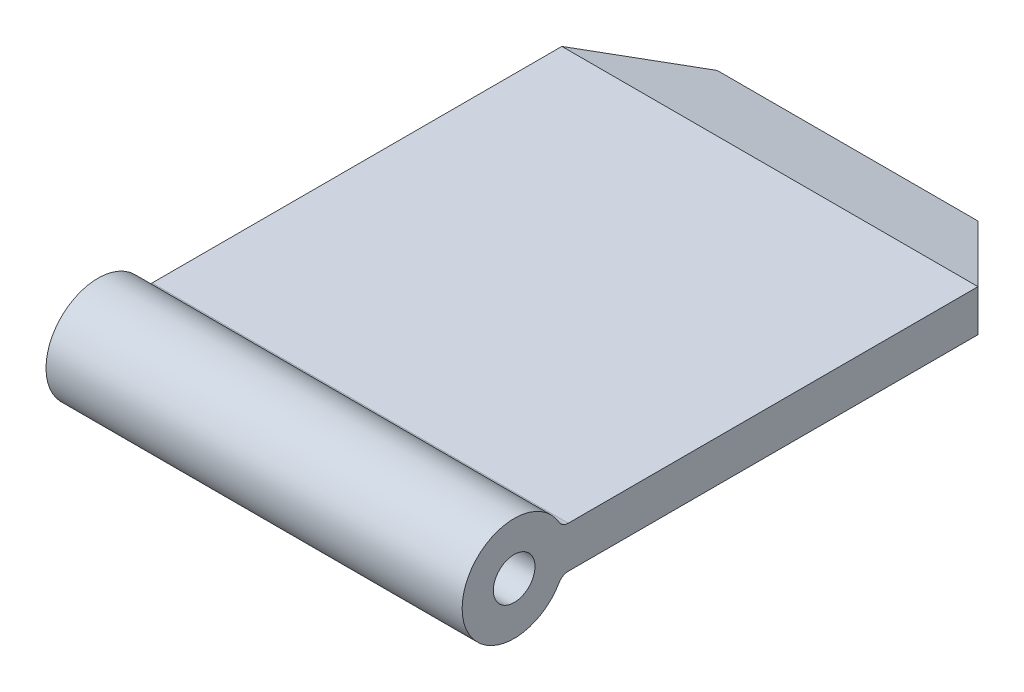
ISO-10303-21;
HEADER;
FILE_DESCRIPTION(('STEP AP214'),'2;1');
FILE_NAME('part.step','',(''),(''),'','','');
FILE_SCHEMA(('AUTOMOTIVE_DESIGN { 1 0 10303 214 1 1 1 1 }'));
ENDSEC;
DATA;
#1=APPLICATION_CONTEXT('core data for automotive mechanical design processes');
#2=APPLICATION_PROTOCOL_DEFINITION('international standard','automotive_design',2000,#1);
#3=PRODUCT_CONTEXT('',#1,'mechanical');
#4=PRODUCT('Part','Part','',(#3));
#5=PRODUCT_RELATED_PRODUCT_CATEGORY('part','',(#4));
#6=PRODUCT_DEFINITION_FORMATION('','',#4);
#7=PRODUCT_DEFINITION_CONTEXT('part definition',#1,'design');
#8=PRODUCT_DEFINITION('design','',#6,#7);
#9=PRODUCT_DEFINITION_SHAPE('','',#8);
#10=(LENGTH_UNIT() NAMED_UNIT(*) SI_UNIT(.MILLI.,.METRE.));
#11=(NAMED_UNIT(*) PLANE_ANGLE_UNIT() SI_UNIT($,.RADIAN.));
#12=(NAMED_UNIT(*) SI_UNIT($,.STERADIAN.) SOLID_ANGLE_UNIT());
#13=UNCERTAINTY_MEASURE_WITH_UNIT(LENGTH_MEASURE(1.E-05),#10,'distance_accuracy_value','');
#14=(GEOMETRIC_REPRESENTATION_CONTEXT(3) GLOBAL_UNCERTAINTY_ASSIGNED_CONTEXT((#13)) GLOBAL_UNIT_ASSIGNED_CONTEXT((#10,
#11,#12)) REPRESENTATION_CONTEXT('',''));
#15=CARTESIAN_POINT('',(0.,0.,0.));
#16=DIRECTION('',(0.,0.,1.));
#17=DIRECTION('',(1.,0.,0.));
#18=AXIS2_PLACEMENT_3D('',#15,#16,#17);
#19=CARTESIAN_POINT('',(101.6,0.,0.));
#20=DIRECTION('',(-1.,0.,0.));
#21=DIRECTION('',(0.,0.,1.));
#22=AXIS2_PLACEMENT_3D('',#19,#20,#21);
#23=CYLINDRICAL_SURFACE('',#22,12.7);
#24=CARTESIAN_POINT('',(0.,0.,0.));
#25=DIRECTION('',(1.,0.,0.));
#26=DIRECTION('',(0.,0.,-1.));
#27=AXIS2_PLACEMENT_3D('',#24,#25,#26);
#28=CIRCLE('',#27,12.7);
#29=CARTESIAN_POINT('',(0.,6.35,-10.9985226280624));
#30=VERTEX_POINT('',#29);
#31=CARTESIAN_POINT('',(0.,-6.35,-10.9985226280624));
#32=VERTEX_POINT('',#31);
#33=EDGE_CURVE('E157',#30,#32,#28,.T.);
#34=ORIENTED_EDGE('',*,*,#33,.T.);
#35=DIRECTION('',(-1.,0.,0.));
#36=VECTOR('',#35,1.);
#37=CARTESIAN_POINT('',(101.6,-6.35,-10.9985226280624));
#38=LINE('',#37,#36);
#39=CARTESIAN_POINT('',(101.6,-6.35,-10.9985226280624));
#40=VERTEX_POINT('',#39);
#41=EDGE_CURVE('E131',#32,#40,#38,.F.);
#42=ORIENTED_EDGE('',*,*,#41,.T.);
#43=CARTESIAN_POINT('',(101.6,0.,0.));
#44=DIRECTION('',(1.,0.,0.));
#45=DIRECTION('',(0.,0.,-1.));
#46=AXIS2_PLACEMENT_3D('',#43,#44,#45);
#47=CIRCLE('',#46,12.7);
#48=CARTESIAN_POINT('',(101.6,6.35,-10.9985226280624));
#49=VERTEX_POINT('',#48);
#50=EDGE_CURVE('E146',#49,#40,#47,.T.);
#51=ORIENTED_EDGE('',*,*,#50,.F.);
#52=DIRECTION('',(-1.,0.,0.));
#53=VECTOR('',#52,1.);
#54=CARTESIAN_POINT('',(101.6,6.35,-10.9985226280624));
#55=LINE('',#54,#53);
#56=EDGE_CURVE('E128',#49,#30,#55,.T.);
#57=ORIENTED_EDGE('',*,*,#56,.T.);
#58=EDGE_LOOP('',(#34,#42,#51,#57));
#59=FACE_BOUND('',#58,.T.);
#60=ADVANCED_FACE('F32',(#59),#23,.T.);
#61=CARTESIAN_POINT('',(101.6,-5.08,-11.6397422651878));
#62=DIRECTION('',(0.,1.,0.));
#63=DIRECTION('',(0.,0.,1.));
#64=AXIS2_PLACEMENT_3D('',#61,#62,#63);
#65=PLANE('',#64);
#66=DIRECTION('',(0.,0.,-1.));
#67=VECTOR('',#66,1.);
#68=CARTESIAN_POINT('',(101.6,-5.08,-11.6397422651878));
#69=LINE('',#68,#67);
#70=CARTESIAN_POINT('',(101.6,-5.08,-13.1982271536748));
#71=VERTEX_POINT('',#70);
#72=CARTESIAN_POINT('',(101.6,-5.08,-113.239742265188));
#73=VERTEX_POINT('',#72);
#74=EDGE_CURVE('E144',#71,#73,#69,.T.);
#75=ORIENTED_EDGE('',*,*,#74,.F.);
#76=DIRECTION('',(1.,0.,0.));
#77=VECTOR('',#76,1.);
#78=CARTESIAN_POINT('',(0.,-5.08,-13.1982271536748));
#79=LINE('',#78,#77);
#80=CARTESIAN_POINT('',(0.,-5.08,-13.1982271536748));
#81=VERTEX_POINT('',#80);
#82=EDGE_CURVE('E125',#71,#81,#79,.F.);
#83=ORIENTED_EDGE('',*,*,#82,.T.);
#84=DIRECTION('',(0.,0.,-1.));
#85=VECTOR('',#84,1.);
#86=CARTESIAN_POINT('',(0.,-5.08,-11.6397422651878));
#87=LINE('',#86,#85);
#88=CARTESIAN_POINT('',(0.,-5.08,-113.239742265188));
#89=VERTEX_POINT('',#88);
#90=EDGE_CURVE('E158',#81,#89,#87,.T.);
#91=ORIENTED_EDGE('',*,*,#90,.T.);
#92=DIRECTION('',(-1.,0.,0.));
#93=VECTOR('',#92,1.);
#94=CARTESIAN_POINT('',(101.6,-5.08,-113.239742265188));
#95=LINE('',#94,#93);
#96=EDGE_CURVE('E109',#73,#89,#95,.T.);
#97=ORIENTED_EDGE('',*,*,#96,.F.);
#98=EDGE_LOOP('',(#75,#83,#91,#97));
#99=FACE_BOUND('',#98,.T.);
#100=ADVANCED_FACE('F151',(#99),#65,.F.);
#101=CARTESIAN_POINT('',(101.6,-5.08,-113.239742265188));
#102=DIRECTION('',(0.,0.965925826289068,0.258819045102522));
#103=DIRECTION('',(0.,-0.258819045102522,0.965925826289068));
#104=AXIS2_PLACEMENT_3D('',#101,#102,#103);
#105=PLANE('',#104);
#106=ORIENTED_EDGE('',*,*,#96,.T.);
#107=DIRECTION('',(0.694746590606866,0.186156787897386,-0.694746590606866));
#108=VECTOR('',#107,1.);
#109=CARTESIAN_POINT('',(49.0395590362422,8.0601102409395,-162.27930130143));
#110=LINE('',#109,#108);
#111=CARTESIAN_POINT('',(18.9588181024498,0.,-132.198560367638));
#112=VERTEX_POINT('',#111);
#113=EDGE_CURVE('E94',#89,#112,#110,.T.);
#114=ORIENTED_EDGE('',*,*,#113,.T.);
#115=DIRECTION('',(-1.,0.,0.));
#116=VECTOR('',#115,1.);
#117=CARTESIAN_POINT('',(101.6,0.,-132.198560367638));
#118=LINE('',#117,#116);
#119=CARTESIAN_POINT('',(82.6411818975502,0.,-132.198560367638));
#120=VERTEX_POINT('',#119);
#121=EDGE_CURVE('E107',#120,#112,#118,.T.);
#122=ORIENTED_EDGE('',*,*,#121,.F.);
#123=DIRECTION('',(0.694746590606866,-0.186156787897386,0.694746590606866));
#124=VECTOR('',#123,1.);
#125=CARTESIAN_POINT('',(101.6,-5.08,-113.239742265188));
#126=LINE('',#125,#124);
#127=EDGE_CURVE('E172',#120,#73,#126,.T.);
#128=ORIENTED_EDGE('',*,*,#127,.T.);
#129=EDGE_LOOP('',(#106,#114,#122,#128));
#130=FACE_BOUND('',#129,.T.);
#131=ADVANCED_FACE('F105',(#130),#105,.F.);
#132=CARTESIAN_POINT('',(101.6,5.08,-113.239742265188));
#133=DIRECTION('',(0.,-0.965925826289068,0.258819045102522));
#134=DIRECTION('',(0.,-0.258819045102522,-0.965925826289068));
#135=AXIS2_PLACEMENT_3D('',#132,#133,#134);
#136=PLANE('',#135);
#137=ORIENTED_EDGE('',*,*,#121,.T.);
#138=DIRECTION('',(-0.694746590606866,0.186156787897386,0.694746590606866));
#139=VECTOR('',#138,1.);
#140=CARTESIAN_POINT('',(49.0395590362422,-8.0601102409395,-162.27930130143));
#141=LINE('',#140,#139);
#142=CARTESIAN_POINT('',(0.,5.07999999999999,-113.239742265188));
#143=VERTEX_POINT('',#142);
#144=EDGE_CURVE('E91',#112,#143,#141,.T.);
#145=ORIENTED_EDGE('',*,*,#144,.T.);
#146=DIRECTION('',(-1.,0.,0.));
#147=VECTOR('',#146,1.);
#148=CARTESIAN_POINT('',(101.6,5.08,-113.239742265188));
#149=LINE('',#148,#147);
#150=CARTESIAN_POINT('',(101.6,5.08,-113.239742265188));
#151=VERTEX_POINT('',#150);
#152=EDGE_CURVE('E114',#151,#143,#149,.T.);
#153=ORIENTED_EDGE('',*,*,#152,.F.);
#154=DIRECTION('',(-0.694746590606866,-0.186156787897386,-0.694746590606866));
#155=VECTOR('',#154,1.);
#156=CARTESIAN_POINT('',(101.6,5.08,-113.239742265188));
#157=LINE('',#156,#155);
#158=EDGE_CURVE('E110',#151,#120,#157,.T.);
#159=ORIENTED_EDGE('',*,*,#158,.T.);
#160=EDGE_LOOP('',(#137,#145,#153,#159));
#161=FACE_BOUND('',#160,.T.);
#162=ADVANCED_FACE('F113',(#161),#136,.F.);
#163=CARTESIAN_POINT('',(101.6,5.08,-11.6397422651878));
#164=DIRECTION('',(0.,-1.,0.));
#165=DIRECTION('',(0.,0.,-1.));
#166=AXIS2_PLACEMENT_3D('',#163,#164,#165);
#167=PLANE('',#166);
#168=DIRECTION('',(0.,0.,1.));
#169=VECTOR('',#168,1.);
#170=CARTESIAN_POINT('',(0.,5.08,-11.6397422651878));
#171=LINE('',#170,#169);
#172=CARTESIAN_POINT('',(0.,5.08,-13.1982271536748));
#173=VERTEX_POINT('',#172);
#174=EDGE_CURVE('E163',#143,#173,#171,.T.);
#175=ORIENTED_EDGE('',*,*,#174,.T.);
#176=DIRECTION('',(1.,0.,0.));
#177=VECTOR('',#176,1.);
#178=CARTESIAN_POINT('',(101.6,5.08,-13.1982271536748));
#179=LINE('',#178,#177);
#180=CARTESIAN_POINT('',(101.6,5.08,-13.1982271536748));
#181=VERTEX_POINT('',#180);
#182=EDGE_CURVE('E47',#173,#181,#179,.T.);
#183=ORIENTED_EDGE('',*,*,#182,.T.);
#184=DIRECTION('',(0.,0.,1.));
#185=VECTOR('',#184,1.);
#186=CARTESIAN_POINT('',(101.6,5.08,-11.6397422651878));
#187=LINE('',#186,#185);
#188=EDGE_CURVE('E117',#151,#181,#187,.T.);
#189=ORIENTED_EDGE('',*,*,#188,.F.);
#190=ORIENTED_EDGE('',*,*,#152,.T.);
#191=EDGE_LOOP('',(#175,#183,#189,#190));
#192=FACE_BOUND('',#191,.T.);
#193=ADVANCED_FACE('F178',(#192),#167,.F.);
#194=CARTESIAN_POINT('',(101.6,0.,0.));
#195=DIRECTION('',(1.,0.,0.));
#196=DIRECTION('',(0.,0.,-1.));
#197=AXIS2_PLACEMENT_3D('',#194,#195,#196);
#198=PLANE('',#197);
#199=DIRECTION('',(0.,-1.,0.));
#200=VECTOR('',#199,1.);
#201=CARTESIAN_POINT('',(101.6,0.,-113.239742265188));
#202=LINE('',#201,#200);
#203=EDGE_CURVE('E122',#151,#73,#202,.T.);
#204=ORIENTED_EDGE('',*,*,#203,.F.);
#205=ORIENTED_EDGE('',*,*,#188,.T.);
#206=CARTESIAN_POINT('',(101.6,7.62,-13.1982271536748));
#207=DIRECTION('',(1.,0.,0.));
#208=DIRECTION('',(0.,0.,-1.));
#209=AXIS2_PLACEMENT_3D('',#206,#207,#208);
#210=CIRCLE('',#209,2.54);
#211=EDGE_CURVE('E11',#181,#49,#210,.F.);
#212=ORIENTED_EDGE('',*,*,#211,.T.);
#213=ORIENTED_EDGE('',*,*,#50,.T.);
#214=CARTESIAN_POINT('',(101.6,-7.62,-13.1982271536748));
#215=DIRECTION('',(1.,0.,0.));
#216=DIRECTION('',(0.,0.,-1.));
#217=AXIS2_PLACEMENT_3D('',#214,#215,#216);
#218=CIRCLE('',#217,2.54);
#219=EDGE_CURVE('E136',#40,#71,#218,.F.);
#220=ORIENTED_EDGE('',*,*,#219,.T.);
#221=ORIENTED_EDGE('',*,*,#74,.T.);
#222=EDGE_LOOP('',(#204,#205,#212,#213,#220,#221));
#223=FACE_BOUND('',#222,.T.);
#224=CARTESIAN_POINT('',(101.6,0.,0.));
#225=DIRECTION('',(1.,0.,0.));
#226=DIRECTION('',(0.,0.,-1.));
#227=AXIS2_PLACEMENT_3D('',#224,#225,#226);
#228=CIRCLE('',#227,5.08);
#229=CARTESIAN_POINT('',(101.6,0.,-5.08));
#230=VERTEX_POINT('',#229);
#231=EDGE_CURVE('E166',#230,#230,#228,.T.);
#232=ORIENTED_EDGE('',*,*,#231,.F.);
#233=EDGE_LOOP('',(#232));
#234=FACE_BOUND('',#233,.T.);
#235=ADVANCED_FACE('F142',(#223,#234),#198,.T.);
#236=CARTESIAN_POINT('',(0.,0.,0.));
#237=DIRECTION('',(1.,0.,0.));
#238=DIRECTION('',(0.,0.,-1.));
#239=AXIS2_PLACEMENT_3D('',#236,#237,#238);
#240=PLANE('',#239);
#241=CARTESIAN_POINT('',(0.,0.,0.));
#242=DIRECTION('',(1.,0.,0.));
#243=DIRECTION('',(0.,0.,-1.));
#244=AXIS2_PLACEMENT_3D('',#241,#242,#243);
#245=CIRCLE('',#244,5.08);
#246=CARTESIAN_POINT('',(0.,0.,-5.08));
#247=VERTEX_POINT('',#246);
#248=EDGE_CURVE('E161',#247,#247,#245,.T.);
#249=ORIENTED_EDGE('',*,*,#248,.T.);
#250=EDGE_LOOP('',(#249));
#251=FACE_BOUND('',#250,.T.);
#252=ORIENTED_EDGE('',*,*,#174,.F.);
#253=DIRECTION('',(0.,-1.,0.));
#254=VECTOR('',#253,1.);
#255=CARTESIAN_POINT('',(0.,0.,-113.239742265188));
#256=LINE('',#255,#254);
#257=EDGE_CURVE('E96',#143,#89,#256,.T.);
#258=ORIENTED_EDGE('',*,*,#257,.T.);
#259=ORIENTED_EDGE('',*,*,#90,.F.);
#260=CARTESIAN_POINT('',(0.,-7.62,-13.1982271536748));
#261=DIRECTION('',(1.,0.,0.));
#262=DIRECTION('',(0.,0.,-1.));
#263=AXIS2_PLACEMENT_3D('',#260,#261,#262);
#264=CIRCLE('',#263,2.54);
#265=EDGE_CURVE('E134',#81,#32,#264,.T.);
#266=ORIENTED_EDGE('',*,*,#265,.T.);
#267=ORIENTED_EDGE('',*,*,#33,.F.);
#268=CARTESIAN_POINT('',(0.,7.62,-13.1982271536748));
#269=DIRECTION('',(1.,0.,0.));
#270=DIRECTION('',(0.,0.,-1.));
#271=AXIS2_PLACEMENT_3D('',#268,#269,#270);
#272=CIRCLE('',#271,2.54);
#273=EDGE_CURVE('E40',#30,#173,#272,.T.);
#274=ORIENTED_EDGE('',*,*,#273,.T.);
#275=EDGE_LOOP('',(#252,#258,#259,#266,#267,#274));
#276=FACE_BOUND('',#275,.T.);
#277=ADVANCED_FACE('F156',(#251,#276),#240,.F.);
#278=CARTESIAN_POINT('',(0.,0.,0.));
#279=DIRECTION('',(1.,0.,0.));
#280=DIRECTION('',(0.,0.,-1.));
#281=AXIS2_PLACEMENT_3D('',#278,#279,#280);
#282=CYLINDRICAL_SURFACE('',#281,5.08);
#283=ORIENTED_EDGE('',*,*,#248,.F.);
#284=EDGE_LOOP('',(#283));
#285=FACE_BOUND('',#284,.T.);
#286=ORIENTED_EDGE('',*,*,#231,.T.);
#287=EDGE_LOOP('',(#286));
#288=FACE_BOUND('',#287,.T.);
#289=ADVANCED_FACE('F205',(#285,#288),#282,.F.);
#290=CARTESIAN_POINT('',(0.,-12.7,-113.239742265188));
#291=DIRECTION('',(0.707106781186548,0.,0.707106781186548));
#292=DIRECTION('',(0.707106781186548,0.,-0.707106781186548));
#293=AXIS2_PLACEMENT_3D('',#290,#291,#292);
#294=PLANE('',#293);
#295=ORIENTED_EDGE('',*,*,#257,.F.);
#296=ORIENTED_EDGE('',*,*,#144,.F.);
#297=ORIENTED_EDGE('',*,*,#113,.F.);
#298=EDGE_LOOP('',(#295,#296,#297));
#299=FACE_BOUND('',#298,.T.);
#300=ADVANCED_FACE('F93',(#299),#294,.F.);
#301=CARTESIAN_POINT('',(101.6,-12.7,-113.239742265188));
#302=DIRECTION('',(-0.707106781186548,0.,0.707106781186548));
#303=DIRECTION('',(0.707106781186548,0.,0.707106781186548));
#304=AXIS2_PLACEMENT_3D('',#301,#302,#303);
#305=PLANE('',#304);
#306=ORIENTED_EDGE('',*,*,#158,.F.);
#307=ORIENTED_EDGE('',*,*,#203,.T.);
#308=ORIENTED_EDGE('',*,*,#127,.F.);
#309=EDGE_LOOP('',(#306,#307,#308));
#310=FACE_BOUND('',#309,.T.);
#311=ADVANCED_FACE('F176',(#310),#305,.F.);
#312=CARTESIAN_POINT('',(101.6,-7.62,-13.1982271536748));
#313=DIRECTION('',(-1.,0.,0.));
#314=DIRECTION('',(0.,0.,1.));
#315=AXIS2_PLACEMENT_3D('',#312,#313,#314);
#316=CYLINDRICAL_SURFACE('',#315,2.54);
#317=ORIENTED_EDGE('',*,*,#219,.F.);
#318=ORIENTED_EDGE('',*,*,#41,.F.);
#319=ORIENTED_EDGE('',*,*,#265,.F.);
#320=ORIENTED_EDGE('',*,*,#82,.F.);
#321=EDGE_LOOP('',(#317,#318,#319,#320));
#322=FACE_BOUND('',#321,.T.);
#323=ADVANCED_FACE('F154',(#322),#316,.F.);
#324=CARTESIAN_POINT('',(101.6,7.62,-13.1982271536748));
#325=DIRECTION('',(-1.,0.,0.));
#326=DIRECTION('',(0.,0.,1.));
#327=AXIS2_PLACEMENT_3D('',#324,#325,#326);
#328=CYLINDRICAL_SURFACE('',#327,2.54);
#329=ORIENTED_EDGE('',*,*,#211,.F.);
#330=ORIENTED_EDGE('',*,*,#182,.F.);
#331=ORIENTED_EDGE('',*,*,#273,.F.);
#332=ORIENTED_EDGE('',*,*,#56,.F.);
#333=EDGE_LOOP('',(#329,#330,#331,#332));
#334=FACE_BOUND('',#333,.T.);
#335=ADVANCED_FACE('F34',(#334),#328,.F.);
#336=CLOSED_SHELL('',(#60,#100,#131,#162,#193,#235,#277,#289,#300,#311,#323,#335));
#337=MANIFOLD_SOLID_BREP('B2',#336);
#338=ADVANCED_BREP_SHAPE_REPRESENTATION('',(#18,#337),#14);
#339=SHAPE_DEFINITION_REPRESENTATION(#9,#338);
ENDSEC;
END-ISO-10303-21;
